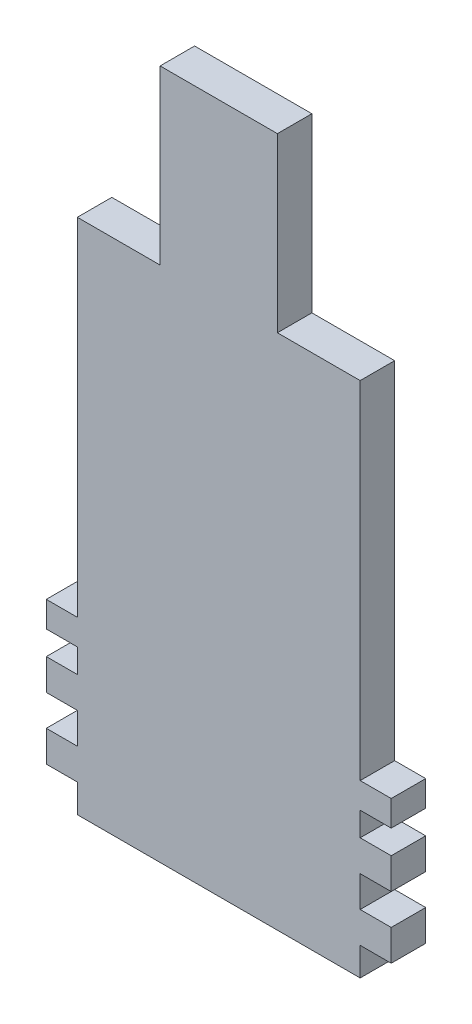
ISO-10303-21;
HEADER;
FILE_DESCRIPTION(('STEP AP214'),'2;1');
FILE_NAME('part.step','',(''),(''),'','','');
FILE_SCHEMA(('AUTOMOTIVE_DESIGN { 1 0 10303 214 1 1 1 1 }'));
ENDSEC;
DATA;
#1=APPLICATION_CONTEXT('core data for automotive mechanical design processes');
#2=APPLICATION_PROTOCOL_DEFINITION('international standard','automotive_design',2000,#1);
#3=PRODUCT_CONTEXT('',#1,'mechanical');
#4=PRODUCT('Part','Part','',(#3));
#5=PRODUCT_RELATED_PRODUCT_CATEGORY('part','',(#4));
#6=PRODUCT_DEFINITION_FORMATION('','',#4);
#7=PRODUCT_DEFINITION_CONTEXT('part definition',#1,'design');
#8=PRODUCT_DEFINITION('design','',#6,#7);
#9=PRODUCT_DEFINITION_SHAPE('','',#8);
#10=(LENGTH_UNIT() NAMED_UNIT(*) SI_UNIT(.MILLI.,.METRE.));
#11=(NAMED_UNIT(*) PLANE_ANGLE_UNIT() SI_UNIT($,.RADIAN.));
#12=(NAMED_UNIT(*) SI_UNIT($,.STERADIAN.) SOLID_ANGLE_UNIT());
#13=UNCERTAINTY_MEASURE_WITH_UNIT(LENGTH_MEASURE(1.E-05),#10,'distance_accuracy_value','');
#14=(GEOMETRIC_REPRESENTATION_CONTEXT(3) GLOBAL_UNCERTAINTY_ASSIGNED_CONTEXT((#13)) GLOBAL_UNIT_ASSIGNED_CONTEXT((#10,
#11,#12)) REPRESENTATION_CONTEXT('',''));
#15=CARTESIAN_POINT('',(0.,0.,0.));
#16=DIRECTION('',(0.,0.,1.));
#17=DIRECTION('',(1.,0.,0.));
#18=AXIS2_PLACEMENT_3D('',#15,#16,#17);
#19=CARTESIAN_POINT('',(0.,134.780205209706,5.));
#20=DIRECTION('',(0.,1.,0.));
#21=DIRECTION('',(0.,0.,1.));
#22=AXIS2_PLACEMENT_3D('',#19,#20,#21);
#23=PLANE('',#22);
#24=DIRECTION('',(1.,0.,0.));
#25=VECTOR('',#24,1.);
#26=CARTESIAN_POINT('',(0.,134.780205209706,0.));
#27=LINE('',#26,#25);
#28=CARTESIAN_POINT('',(-76.921426264111,134.780205209706,0.));
#29=VERTEX_POINT('',#28);
#30=CARTESIAN_POINT('',(-59.921426264111,134.780205209706,0.));
#31=VERTEX_POINT('',#30);
#32=EDGE_CURVE('E271',#29,#31,#27,.T.);
#33=ORIENTED_EDGE('',*,*,#32,.F.);
#34=DIRECTION('',(0.,0.,-1.));
#35=VECTOR('',#34,1.);
#36=CARTESIAN_POINT('',(-76.921426264111,134.780205209706,5.));
#37=LINE('',#36,#35);
#38=CARTESIAN_POINT('',(-76.921426264111,134.780205209706,5.));
#39=VERTEX_POINT('',#38);
#40=EDGE_CURVE('E11',#39,#29,#37,.T.);
#41=ORIENTED_EDGE('',*,*,#40,.F.);
#42=DIRECTION('',(1.,0.,0.));
#43=VECTOR('',#42,1.);
#44=CARTESIAN_POINT('',(0.,134.780205209706,5.));
#45=LINE('',#44,#43);
#46=CARTESIAN_POINT('',(-59.921426264111,134.780205209706,5.));
#47=VERTEX_POINT('',#46);
#48=EDGE_CURVE('E356',#39,#47,#45,.T.);
#49=ORIENTED_EDGE('',*,*,#48,.T.);
#50=DIRECTION('',(0.,0.,-1.));
#51=VECTOR('',#50,1.);
#52=CARTESIAN_POINT('',(-59.921426264111,134.780205209706,5.));
#53=LINE('',#52,#51);
#54=EDGE_CURVE('E158',#47,#31,#53,.T.);
#55=ORIENTED_EDGE('',*,*,#54,.T.);
#56=EDGE_LOOP('',(#33,#41,#49,#55));
#57=FACE_BOUND('',#56,.T.);
#58=ADVANCED_FACE('F35',(#57),#23,.T.);
#59=CARTESIAN_POINT('',(-76.921426264111,0.,5.));
#60=DIRECTION('',(-1.,0.,0.));
#61=DIRECTION('',(0.,0.,1.));
#62=AXIS2_PLACEMENT_3D('',#59,#60,#61);
#63=PLANE('',#62);
#64=DIRECTION('',(0.,1.,0.));
#65=VECTOR('',#64,1.);
#66=CARTESIAN_POINT('',(-76.921426264111,0.,0.));
#67=LINE('',#66,#65);
#68=CARTESIAN_POINT('',(-76.921426264111,109.780205209706,0.));
#69=VERTEX_POINT('',#68);
#70=EDGE_CURVE('E274',#69,#29,#67,.T.);
#71=ORIENTED_EDGE('',*,*,#70,.F.);
#72=DIRECTION('',(0.,0.,-1.));
#73=VECTOR('',#72,1.);
#74=CARTESIAN_POINT('',(-76.921426264111,109.780205209706,5.));
#75=LINE('',#74,#73);
#76=CARTESIAN_POINT('',(-76.921426264111,109.780205209706,5.));
#77=VERTEX_POINT('',#76);
#78=EDGE_CURVE('E43',#77,#69,#75,.T.);
#79=ORIENTED_EDGE('',*,*,#78,.F.);
#80=DIRECTION('',(0.,1.,0.));
#81=VECTOR('',#80,1.);
#82=CARTESIAN_POINT('',(-76.921426264111,0.,5.));
#83=LINE('',#82,#81);
#84=EDGE_CURVE('E438',#77,#39,#83,.T.);
#85=ORIENTED_EDGE('',*,*,#84,.T.);
#86=ORIENTED_EDGE('',*,*,#40,.T.);
#87=EDGE_LOOP('',(#71,#79,#85,#86));
#88=FACE_BOUND('',#87,.T.);
#89=ADVANCED_FACE('F426',(#88),#63,.T.);
#90=CARTESIAN_POINT('',(0.,109.780205209706,5.));
#91=DIRECTION('',(0.,1.,0.));
#92=DIRECTION('',(0.,0.,1.));
#93=AXIS2_PLACEMENT_3D('',#90,#91,#92);
#94=PLANE('',#93);
#95=DIRECTION('',(1.,0.,0.));
#96=VECTOR('',#95,1.);
#97=CARTESIAN_POINT('',(0.,109.780205209706,0.));
#98=LINE('',#97,#96);
#99=CARTESIAN_POINT('',(-88.9214262641108,109.780205209706,0.));
#100=VERTEX_POINT('',#99);
#101=EDGE_CURVE('E277',#100,#69,#98,.T.);
#102=ORIENTED_EDGE('',*,*,#101,.F.);
#103=DIRECTION('',(0.,0.,-1.));
#104=VECTOR('',#103,1.);
#105=CARTESIAN_POINT('',(-88.9214262641108,109.780205209706,5.));
#106=LINE('',#105,#104);
#107=CARTESIAN_POINT('',(-88.9214262641108,109.780205209706,5.));
#108=VERTEX_POINT('',#107);
#109=EDGE_CURVE('E415',#108,#100,#106,.T.);
#110=ORIENTED_EDGE('',*,*,#109,.F.);
#111=DIRECTION('',(1.,0.,0.));
#112=VECTOR('',#111,1.);
#113=CARTESIAN_POINT('',(0.,109.780205209706,5.));
#114=LINE('',#113,#112);
#115=EDGE_CURVE('E422',#108,#77,#114,.T.);
#116=ORIENTED_EDGE('',*,*,#115,.T.);
#117=ORIENTED_EDGE('',*,*,#78,.T.);
#118=EDGE_LOOP('',(#102,#110,#116,#117));
#119=FACE_BOUND('',#118,.T.);
#120=ADVANCED_FACE('F420',(#119),#94,.T.);
#121=CARTESIAN_POINT('',(-88.921426264112,9.82996824033786E-13,5.));
#122=DIRECTION('',(-1.,0.,0.));
#123=DIRECTION('',(0.,-1.,0.));
#124=AXIS2_PLACEMENT_3D('',#121,#122,#123);
#125=PLANE('',#124);
#126=DIRECTION('',(0.,1.,0.));
#127=VECTOR('',#126,1.);
#128=CARTESIAN_POINT('',(-88.921426264112,9.82996824033786E-13,0.));
#129=LINE('',#128,#127);
#130=CARTESIAN_POINT('',(-88.9214262641113,59.5650812097062,0.));
#131=VERTEX_POINT('',#130);
#132=EDGE_CURVE('E280',#131,#100,#129,.T.);
#133=ORIENTED_EDGE('',*,*,#132,.F.);
#134=DIRECTION('',(0.,0.,-1.));
#135=VECTOR('',#134,1.);
#136=CARTESIAN_POINT('',(-88.9214262641113,59.5650812097062,5.));
#137=LINE('',#136,#135);
#138=CARTESIAN_POINT('',(-88.9214262641113,59.5650812097062,5.));
#139=VERTEX_POINT('',#138);
#140=EDGE_CURVE('E413',#139,#131,#137,.T.);
#141=ORIENTED_EDGE('',*,*,#140,.F.);
#142=DIRECTION('',(0.,1.,0.));
#143=VECTOR('',#142,1.);
#144=CARTESIAN_POINT('',(-88.921426264112,9.82996824033786E-13,5.));
#145=LINE('',#144,#143);
#146=EDGE_CURVE('E435',#139,#108,#145,.T.);
#147=ORIENTED_EDGE('',*,*,#146,.T.);
#148=ORIENTED_EDGE('',*,*,#109,.T.);
#149=EDGE_LOOP('',(#133,#141,#147,#148));
#150=FACE_BOUND('',#149,.T.);
#151=ADVANCED_FACE('F432',(#150),#125,.T.);
#152=CARTESIAN_POINT('',(1.83695901729669E-13,59.5650812097059,5.));
#153=DIRECTION('',(0.,1.,0.));
#154=DIRECTION('',(-1.,0.,0.));
#155=AXIS2_PLACEMENT_3D('',#152,#153,#154);
#156=PLANE('',#155);
#157=DIRECTION('',(1.,0.,0.));
#158=VECTOR('',#157,1.);
#159=CARTESIAN_POINT('',(1.83695901729669E-13,59.5650812097059,0.));
#160=LINE('',#159,#158);
#161=CARTESIAN_POINT('',(-93.4214262641115,59.5650812097062,0.));
#162=VERTEX_POINT('',#161);
#163=EDGE_CURVE('E283',#162,#131,#160,.T.);
#164=ORIENTED_EDGE('',*,*,#163,.F.);
#165=DIRECTION('',(0.,0.,-1.));
#166=VECTOR('',#165,1.);
#167=CARTESIAN_POINT('',(-93.4214262641115,59.5650812097062,5.));
#168=LINE('',#167,#166);
#169=CARTESIAN_POINT('',(-93.4214262641115,59.5650812097062,5.));
#170=VERTEX_POINT('',#169);
#171=EDGE_CURVE('E411',#170,#162,#168,.T.);
#172=ORIENTED_EDGE('',*,*,#171,.F.);
#173=DIRECTION('',(1.,0.,0.));
#174=VECTOR('',#173,1.);
#175=CARTESIAN_POINT('',(1.83695901729669E-13,59.5650812097059,5.));
#176=LINE('',#175,#174);
#177=EDGE_CURVE('E440',#170,#139,#176,.T.);
#178=ORIENTED_EDGE('',*,*,#177,.T.);
#179=ORIENTED_EDGE('',*,*,#140,.T.);
#180=EDGE_LOOP('',(#164,#172,#178,#179));
#181=FACE_BOUND('',#180,.T.);
#182=ADVANCED_FACE('F526',(#181),#156,.T.);
#183=CARTESIAN_POINT('',(-93.4214262641124,1.39378120235169E-12,5.));
#184=DIRECTION('',(-1.,0.,0.));
#185=DIRECTION('',(0.,-1.,0.));
#186=AXIS2_PLACEMENT_3D('',#183,#184,#185);
#187=PLANE('',#186);
#188=DIRECTION('',(0.,1.,0.));
#189=VECTOR('',#188,1.);
#190=CARTESIAN_POINT('',(-93.4214262641124,1.39378120235169E-12,0.));
#191=LINE('',#190,#189);
#192=CARTESIAN_POINT('',(-93.4214262641115,55.8443172097062,0.));
#193=VERTEX_POINT('',#192);
#194=EDGE_CURVE('E286',#193,#162,#191,.T.);
#195=ORIENTED_EDGE('',*,*,#194,.F.);
#196=DIRECTION('',(0.,0.,-1.));
#197=VECTOR('',#196,1.);
#198=CARTESIAN_POINT('',(-93.4214262641115,55.8443172097062,5.));
#199=LINE('',#198,#197);
#200=CARTESIAN_POINT('',(-93.4214262641115,55.8443172097062,5.));
#201=VERTEX_POINT('',#200);
#202=EDGE_CURVE('E409',#201,#193,#199,.T.);
#203=ORIENTED_EDGE('',*,*,#202,.F.);
#204=DIRECTION('',(0.,1.,0.));
#205=VECTOR('',#204,1.);
#206=CARTESIAN_POINT('',(-93.4214262641124,1.39378120235169E-12,5.));
#207=LINE('',#206,#205);
#208=EDGE_CURVE('E446',#201,#170,#207,.T.);
#209=ORIENTED_EDGE('',*,*,#208,.T.);
#210=ORIENTED_EDGE('',*,*,#171,.T.);
#211=EDGE_LOOP('',(#195,#203,#209,#210));
#212=FACE_BOUND('',#211,.T.);
#213=ADVANCED_FACE('F529',(#212),#187,.T.);
#214=CARTESIAN_POINT('',(1.72221241001906E-13,55.8443172097059,5.));
#215=DIRECTION('',(0.,1.,0.));
#216=DIRECTION('',(-1.,0.,0.));
#217=AXIS2_PLACEMENT_3D('',#214,#215,#216);
#218=PLANE('',#217);
#219=DIRECTION('',(1.,0.,0.));
#220=VECTOR('',#219,1.);
#221=CARTESIAN_POINT('',(1.72221241001906E-13,55.8443172097059,0.));
#222=LINE('',#221,#220);
#223=CARTESIAN_POINT('',(-88.9214262641115,55.8443172097061,0.));
#224=VERTEX_POINT('',#223);
#225=EDGE_CURVE('E289',#193,#224,#222,.T.);
#226=ORIENTED_EDGE('',*,*,#225,.T.);
#227=DIRECTION('',(0.,0.,-1.));
#228=VECTOR('',#227,1.);
#229=CARTESIAN_POINT('',(-88.9214262641115,55.8443172097061,5.));
#230=LINE('',#229,#228);
#231=CARTESIAN_POINT('',(-88.9214262641115,55.8443172097061,5.));
#232=VERTEX_POINT('',#231);
#233=EDGE_CURVE('E407',#232,#224,#230,.T.);
#234=ORIENTED_EDGE('',*,*,#233,.F.);
#235=DIRECTION('',(1.,0.,0.));
#236=VECTOR('',#235,1.);
#237=CARTESIAN_POINT('',(1.72221241001906E-13,55.8443172097059,5.));
#238=LINE('',#237,#236);
#239=EDGE_CURVE('E449',#201,#232,#238,.T.);
#240=ORIENTED_EDGE('',*,*,#239,.F.);
#241=ORIENTED_EDGE('',*,*,#202,.T.);
#242=EDGE_LOOP('',(#226,#234,#240,#241));
#243=FACE_BOUND('',#242,.T.);
#244=ADVANCED_FACE('F533',(#243),#218,.F.);
#245=CARTESIAN_POINT('',(-88.9214262641117,3.56233483577195E-13,5.));
#246=DIRECTION('',(-1.,0.,0.));
#247=DIRECTION('',(0.,-1.,0.));
#248=AXIS2_PLACEMENT_3D('',#245,#246,#247);
#249=PLANE('',#248);
#250=DIRECTION('',(0.,1.,0.));
#251=VECTOR('',#250,1.);
#252=CARTESIAN_POINT('',(-88.9214262641117,3.56233483577195E-13,0.));
#253=LINE('',#252,#251);
#254=CARTESIAN_POINT('',(-88.9214262641115,52.3802052097061,0.));
#255=VERTEX_POINT('',#254);
#256=EDGE_CURVE('E292',#255,#224,#253,.T.);
#257=ORIENTED_EDGE('',*,*,#256,.F.);
#258=DIRECTION('',(0.,0.,-1.));
#259=VECTOR('',#258,1.);
#260=CARTESIAN_POINT('',(-88.9214262641115,52.3802052097061,5.));
#261=LINE('',#260,#259);
#262=CARTESIAN_POINT('',(-88.9214262641115,52.3802052097061,5.));
#263=VERTEX_POINT('',#262);
#264=EDGE_CURVE('E405',#263,#255,#261,.T.);
#265=ORIENTED_EDGE('',*,*,#264,.F.);
#266=DIRECTION('',(0.,1.,0.));
#267=VECTOR('',#266,1.);
#268=CARTESIAN_POINT('',(-88.9214262641117,3.56233483577195E-13,5.));
#269=LINE('',#268,#267);
#270=EDGE_CURVE('E451',#263,#232,#269,.T.);
#271=ORIENTED_EDGE('',*,*,#270,.T.);
#272=ORIENTED_EDGE('',*,*,#233,.T.);
#273=EDGE_LOOP('',(#257,#265,#271,#272));
#274=FACE_BOUND('',#273,.T.);
#275=ADVANCED_FACE('F537',(#274),#249,.T.);
#276=CARTESIAN_POINT('',(-2.42307124410028E-13,52.3802052097066,5.));
#277=DIRECTION('',(0.,1.,0.));
#278=DIRECTION('',(-1.,0.,0.));
#279=AXIS2_PLACEMENT_3D('',#276,#277,#278);
#280=PLANE('',#279);
#281=DIRECTION('',(1.,0.,0.));
#282=VECTOR('',#281,1.);
#283=CARTESIAN_POINT('',(-2.42307124410028E-13,52.3802052097066,0.));
#284=LINE('',#283,#282);
#285=CARTESIAN_POINT('',(-93.4214262641115,52.3802052097061,0.));
#286=VERTEX_POINT('',#285);
#287=EDGE_CURVE('E295',#286,#255,#284,.T.);
#288=ORIENTED_EDGE('',*,*,#287,.F.);
#289=DIRECTION('',(0.,0.,-1.));
#290=VECTOR('',#289,1.);
#291=CARTESIAN_POINT('',(-93.4214262641115,52.3802052097061,5.));
#292=LINE('',#291,#290);
#293=CARTESIAN_POINT('',(-93.4214262641115,52.3802052097061,5.));
#294=VERTEX_POINT('',#293);
#295=EDGE_CURVE('E403',#294,#286,#292,.T.);
#296=ORIENTED_EDGE('',*,*,#295,.F.);
#297=DIRECTION('',(1.,0.,0.));
#298=VECTOR('',#297,1.);
#299=CARTESIAN_POINT('',(-2.42307124410028E-13,52.3802052097066,5.));
#300=LINE('',#299,#298);
#301=EDGE_CURVE('E454',#294,#263,#300,.T.);
#302=ORIENTED_EDGE('',*,*,#301,.T.);
#303=ORIENTED_EDGE('',*,*,#264,.T.);
#304=EDGE_LOOP('',(#288,#296,#302,#303));
#305=FACE_BOUND('',#304,.T.);
#306=ADVANCED_FACE('F541',(#305),#280,.T.);
#307=CARTESIAN_POINT('',(-93.4214262641054,-1.09480763900161E-11,5.));
#308=DIRECTION('',(-1.,-1.17190208154878E-13,0.));
#309=DIRECTION('',(1.17190208154878E-13,-1.,0.));
#310=AXIS2_PLACEMENT_3D('',#307,#308,#309);
#311=PLANE('',#310);
#312=DIRECTION('',(-1.17190208154878E-13,1.,0.));
#313=VECTOR('',#312,1.);
#314=CARTESIAN_POINT('',(-93.4214262641054,-1.09480763900161E-11,0.));
#315=LINE('',#314,#313);
#316=CARTESIAN_POINT('',(-93.421426264111,47.8802052097061,0.));
#317=VERTEX_POINT('',#316);
#318=EDGE_CURVE('E298',#317,#286,#315,.T.);
#319=ORIENTED_EDGE('',*,*,#318,.F.);
#320=DIRECTION('',(0.,0.,-1.));
#321=VECTOR('',#320,1.);
#322=CARTESIAN_POINT('',(-93.421426264111,47.8802052097061,5.));
#323=LINE('',#322,#321);
#324=CARTESIAN_POINT('',(-93.421426264111,47.8802052097061,5.));
#325=VERTEX_POINT('',#324);
#326=EDGE_CURVE('E401',#325,#317,#323,.T.);
#327=ORIENTED_EDGE('',*,*,#326,.F.);
#328=DIRECTION('',(-1.17190208154878E-13,1.,0.));
#329=VECTOR('',#328,1.);
#330=CARTESIAN_POINT('',(-93.4214262641054,-1.09480763900161E-11,5.));
#331=LINE('',#330,#329);
#332=EDGE_CURVE('E457',#325,#294,#331,.T.);
#333=ORIENTED_EDGE('',*,*,#332,.T.);
#334=ORIENTED_EDGE('',*,*,#295,.T.);
#335=EDGE_LOOP('',(#319,#327,#333,#334));
#336=FACE_BOUND('',#335,.T.);
#337=ADVANCED_FACE('F545',(#336),#311,.T.);
#338=CARTESIAN_POINT('',(-2.95320590264413E-13,47.8802052097067,5.));
#339=DIRECTION('',(0.,1.,0.));
#340=DIRECTION('',(-1.,0.,0.));
#341=AXIS2_PLACEMENT_3D('',#338,#339,#340);
#342=PLANE('',#341);
#343=DIRECTION('',(1.,0.,0.));
#344=VECTOR('',#343,1.);
#345=CARTESIAN_POINT('',(-2.95320590264413E-13,47.8802052097067,0.));
#346=LINE('',#345,#344);
#347=CARTESIAN_POINT('',(-88.9214262641111,47.8802052097062,0.));
#348=VERTEX_POINT('',#347);
#349=EDGE_CURVE('E301',#317,#348,#346,.T.);
#350=ORIENTED_EDGE('',*,*,#349,.T.);
#351=DIRECTION('',(0.,0.,-1.));
#352=VECTOR('',#351,1.);
#353=CARTESIAN_POINT('',(-88.9214262641111,47.8802052097062,5.));
#354=LINE('',#353,#352);
#355=CARTESIAN_POINT('',(-88.9214262641111,47.8802052097062,5.));
#356=VERTEX_POINT('',#355);
#357=EDGE_CURVE('E399',#356,#348,#354,.T.);
#358=ORIENTED_EDGE('',*,*,#357,.F.);
#359=DIRECTION('',(1.,0.,0.));
#360=VECTOR('',#359,1.);
#361=CARTESIAN_POINT('',(-2.95320590264413E-13,47.8802052097067,5.));
#362=LINE('',#361,#360);
#363=EDGE_CURVE('E460',#325,#356,#362,.T.);
#364=ORIENTED_EDGE('',*,*,#363,.F.);
#365=ORIENTED_EDGE('',*,*,#326,.T.);
#366=EDGE_LOOP('',(#350,#358,#364,#365));
#367=FACE_BOUND('',#366,.T.);
#368=ADVANCED_FACE('F549',(#367),#342,.F.);
#369=CARTESIAN_POINT('',(-88.9214262641108,-5.48458971227346E-13,5.));
#370=DIRECTION('',(-1.,0.,0.));
#371=DIRECTION('',(0.,-1.,0.));
#372=AXIS2_PLACEMENT_3D('',#369,#370,#371);
#373=PLANE('',#372);
#374=DIRECTION('',(0.,1.,0.));
#375=VECTOR('',#374,1.);
#376=CARTESIAN_POINT('',(-88.9214262641108,-5.48458971227346E-13,0.));
#377=LINE('',#376,#375);
#378=CARTESIAN_POINT('',(-88.921426264111,43.3802052097061,0.));
#379=VERTEX_POINT('',#378);
#380=EDGE_CURVE('E304',#379,#348,#377,.T.);
#381=ORIENTED_EDGE('',*,*,#380,.F.);
#382=DIRECTION('',(0.,0.,-1.));
#383=VECTOR('',#382,1.);
#384=CARTESIAN_POINT('',(-88.921426264111,43.3802052097061,5.));
#385=LINE('',#384,#383);
#386=CARTESIAN_POINT('',(-88.921426264111,43.3802052097061,5.));
#387=VERTEX_POINT('',#386);
#388=EDGE_CURVE('E397',#387,#379,#385,.T.);
#389=ORIENTED_EDGE('',*,*,#388,.F.);
#390=DIRECTION('',(0.,1.,0.));
#391=VECTOR('',#390,1.);
#392=CARTESIAN_POINT('',(-88.9214262641108,-5.48458971227346E-13,5.));
#393=LINE('',#392,#391);
#394=EDGE_CURVE('E462',#387,#356,#393,.T.);
#395=ORIENTED_EDGE('',*,*,#394,.T.);
#396=ORIENTED_EDGE('',*,*,#357,.T.);
#397=EDGE_LOOP('',(#381,#389,#395,#396));
#398=FACE_BOUND('',#397,.T.);
#399=ADVANCED_FACE('F553',(#398),#373,.T.);
#400=CARTESIAN_POINT('',(-1.33782507324388E-13,43.3802052097064,5.));
#401=DIRECTION('',(0.,1.,0.));
#402=DIRECTION('',(-1.,0.,0.));
#403=AXIS2_PLACEMENT_3D('',#400,#401,#402);
#404=PLANE('',#403);
#405=DIRECTION('',(1.,0.,0.));
#406=VECTOR('',#405,1.);
#407=CARTESIAN_POINT('',(-1.33782507324388E-13,43.3802052097064,0.));
#408=LINE('',#407,#406);
#409=CARTESIAN_POINT('',(-93.4214262641111,43.3802052097061,0.));
#410=VERTEX_POINT('',#409);
#411=EDGE_CURVE('E307',#410,#379,#408,.T.);
#412=ORIENTED_EDGE('',*,*,#411,.F.);
#413=DIRECTION('',(0.,0.,-1.));
#414=VECTOR('',#413,1.);
#415=CARTESIAN_POINT('',(-93.4214262641111,43.3802052097061,5.));
#416=LINE('',#415,#414);
#417=CARTESIAN_POINT('',(-93.4214262641111,43.3802052097061,5.));
#418=VERTEX_POINT('',#417);
#419=EDGE_CURVE('E395',#418,#410,#416,.T.);
#420=ORIENTED_EDGE('',*,*,#419,.F.);
#421=DIRECTION('',(1.,0.,0.));
#422=VECTOR('',#421,1.);
#423=CARTESIAN_POINT('',(-1.33782507324388E-13,43.3802052097064,5.));
#424=LINE('',#423,#422);
#425=EDGE_CURVE('E465',#418,#387,#424,.T.);
#426=ORIENTED_EDGE('',*,*,#425,.T.);
#427=ORIENTED_EDGE('',*,*,#388,.T.);
#428=EDGE_LOOP('',(#412,#420,#426,#427));
#429=FACE_BOUND('',#428,.T.);
#430=ADVANCED_FACE('F557',(#429),#404,.T.);
#431=CARTESIAN_POINT('',(-93.4214262641108,-5.76214546842989E-13,5.));
#432=DIRECTION('',(-1.,0.,0.));
#433=DIRECTION('',(0.,-1.,0.));
#434=AXIS2_PLACEMENT_3D('',#431,#432,#433);
#435=PLANE('',#434);
#436=DIRECTION('',(0.,1.,0.));
#437=VECTOR('',#436,1.);
#438=CARTESIAN_POINT('',(-93.4214262641108,-5.76214546842989E-13,0.));
#439=LINE('',#438,#437);
#440=CARTESIAN_POINT('',(-93.421426264111,38.8802052097061,0.));
#441=VERTEX_POINT('',#440);
#442=EDGE_CURVE('E310',#441,#410,#439,.T.);
#443=ORIENTED_EDGE('',*,*,#442,.F.);
#444=DIRECTION('',(0.,0.,-1.));
#445=VECTOR('',#444,1.);
#446=CARTESIAN_POINT('',(-93.421426264111,38.8802052097061,5.));
#447=LINE('',#446,#445);
#448=CARTESIAN_POINT('',(-93.421426264111,38.8802052097061,5.));
#449=VERTEX_POINT('',#448);
#450=EDGE_CURVE('E393',#449,#441,#447,.T.);
#451=ORIENTED_EDGE('',*,*,#450,.F.);
#452=DIRECTION('',(0.,1.,0.));
#453=VECTOR('',#452,1.);
#454=CARTESIAN_POINT('',(-93.4214262641108,-5.76214546842989E-13,5.));
#455=LINE('',#454,#453);
#456=EDGE_CURVE('E468',#449,#418,#455,.T.);
#457=ORIENTED_EDGE('',*,*,#456,.T.);
#458=ORIENTED_EDGE('',*,*,#419,.T.);
#459=EDGE_LOOP('',(#443,#451,#457,#458));
#460=FACE_BOUND('',#459,.T.);
#461=ADVANCED_FACE('F561',(#460),#435,.T.);
#462=CARTESIAN_POINT('',(-1.79857079274863E-13,38.8802052097066,5.));
#463=DIRECTION('',(0.,1.,0.));
#464=DIRECTION('',(-1.,0.,0.));
#465=AXIS2_PLACEMENT_3D('',#462,#463,#464);
#466=PLANE('',#465);
#467=DIRECTION('',(1.,0.,0.));
#468=VECTOR('',#467,1.);
#469=CARTESIAN_POINT('',(-1.79857079274863E-13,38.8802052097066,0.));
#470=LINE('',#469,#468);
#471=CARTESIAN_POINT('',(-88.921426264111,38.8802052097061,0.));
#472=VERTEX_POINT('',#471);
#473=EDGE_CURVE('E313',#441,#472,#470,.T.);
#474=ORIENTED_EDGE('',*,*,#473,.T.);
#475=DIRECTION('',(0.,0.,-1.));
#476=VECTOR('',#475,1.);
#477=CARTESIAN_POINT('',(-88.921426264111,38.8802052097061,5.));
#478=LINE('',#477,#476);
#479=CARTESIAN_POINT('',(-88.921426264111,38.8802052097061,5.));
#480=VERTEX_POINT('',#479);
#481=EDGE_CURVE('E391',#480,#472,#478,.T.);
#482=ORIENTED_EDGE('',*,*,#481,.F.);
#483=DIRECTION('',(1.,0.,0.));
#484=VECTOR('',#483,1.);
#485=CARTESIAN_POINT('',(-1.79857079274863E-13,38.8802052097066,5.));
#486=LINE('',#485,#484);
#487=EDGE_CURVE('E471',#449,#480,#486,.T.);
#488=ORIENTED_EDGE('',*,*,#487,.F.);
#489=ORIENTED_EDGE('',*,*,#450,.T.);
#490=EDGE_LOOP('',(#474,#482,#488,#489));
#491=FACE_BOUND('',#490,.T.);
#492=ADVANCED_FACE('F565',(#491),#466,.F.);
#493=CARTESIAN_POINT('',(-88.9214262641109,-3.0098358177111E-13,5.));
#494=DIRECTION('',(-1.,0.,0.));
#495=DIRECTION('',(0.,-1.,0.));
#496=AXIS2_PLACEMENT_3D('',#493,#494,#495);
#497=PLANE('',#496);
#498=DIRECTION('',(0.,1.,0.));
#499=VECTOR('',#498,1.);
#500=CARTESIAN_POINT('',(-88.9214262641109,-3.0098358177111E-13,0.));
#501=LINE('',#500,#499);
#502=CARTESIAN_POINT('',(-88.921426264111,34.7802052097062,0.));
#503=VERTEX_POINT('',#502);
#504=EDGE_CURVE('E316',#503,#472,#501,.T.);
#505=ORIENTED_EDGE('',*,*,#504,.F.);
#506=DIRECTION('',(0.,0.,-1.));
#507=VECTOR('',#506,1.);
#508=CARTESIAN_POINT('',(-88.921426264111,34.7802052097062,5.));
#509=LINE('',#508,#507);
#510=CARTESIAN_POINT('',(-88.921426264111,34.7802052097062,5.));
#511=VERTEX_POINT('',#510);
#512=EDGE_CURVE('E389',#511,#503,#509,.T.);
#513=ORIENTED_EDGE('',*,*,#512,.F.);
#514=DIRECTION('',(0.,1.,0.));
#515=VECTOR('',#514,1.);
#516=CARTESIAN_POINT('',(-88.9214262641109,-3.0098358177111E-13,5.));
#517=LINE('',#516,#515);
#518=EDGE_CURVE('E473',#511,#480,#517,.T.);
#519=ORIENTED_EDGE('',*,*,#518,.T.);
#520=ORIENTED_EDGE('',*,*,#481,.T.);
#521=EDGE_LOOP('',(#505,#513,#519,#520));
#522=FACE_BOUND('',#521,.T.);
#523=ADVANCED_FACE('F569',(#522),#497,.T.);
#524=CARTESIAN_POINT('',(0.,34.780205209706,5.));
#525=DIRECTION('',(0.,-1.,0.));
#526=DIRECTION('',(1.,0.,0.));
#527=AXIS2_PLACEMENT_3D('',#524,#525,#526);
#528=PLANE('',#527);
#529=DIRECTION('',(-1.,0.,0.));
#530=VECTOR('',#529,1.);
#531=CARTESIAN_POINT('',(0.,34.780205209706,0.));
#532=LINE('',#531,#530);
#533=CARTESIAN_POINT('',(-47.921426264111,34.7802052097061,0.));
#534=VERTEX_POINT('',#533);
#535=EDGE_CURVE('E319',#534,#503,#532,.T.);
#536=ORIENTED_EDGE('',*,*,#535,.F.);
#537=DIRECTION('',(0.,0.,-1.));
#538=VECTOR('',#537,1.);
#539=CARTESIAN_POINT('',(-47.921426264111,34.7802052097061,5.));
#540=LINE('',#539,#538);
#541=CARTESIAN_POINT('',(-47.921426264111,34.7802052097061,5.));
#542=VERTEX_POINT('',#541);
#543=EDGE_CURVE('E387',#542,#534,#540,.T.);
#544=ORIENTED_EDGE('',*,*,#543,.F.);
#545=DIRECTION('',(-1.,0.,0.));
#546=VECTOR('',#545,1.);
#547=CARTESIAN_POINT('',(0.,34.780205209706,5.));
#548=LINE('',#547,#546);
#549=EDGE_CURVE('E476',#542,#511,#548,.T.);
#550=ORIENTED_EDGE('',*,*,#549,.T.);
#551=ORIENTED_EDGE('',*,*,#512,.T.);
#552=EDGE_LOOP('',(#536,#544,#550,#551));
#553=FACE_BOUND('',#552,.T.);
#554=ADVANCED_FACE('F573',(#553),#528,.T.);
#555=CARTESIAN_POINT('',(-47.9214262641113,4.05514259232417E-13,5.));
#556=DIRECTION('',(-1.,0.,0.));
#557=DIRECTION('',(0.,-1.,0.));
#558=AXIS2_PLACEMENT_3D('',#555,#556,#557);
#559=PLANE('',#558);
#560=DIRECTION('',(0.,1.,0.));
#561=VECTOR('',#560,1.);
#562=CARTESIAN_POINT('',(-47.9214262641113,4.05514259232417E-13,0.));
#563=LINE('',#562,#561);
#564=CARTESIAN_POINT('',(-47.921426264111,38.8802052097061,0.));
#565=VERTEX_POINT('',#564);
#566=EDGE_CURVE('E322',#534,#565,#563,.T.);
#567=ORIENTED_EDGE('',*,*,#566,.T.);
#568=DIRECTION('',(0.,0.,-1.));
#569=VECTOR('',#568,1.);
#570=CARTESIAN_POINT('',(-47.921426264111,38.8802052097061,5.));
#571=LINE('',#570,#569);
#572=CARTESIAN_POINT('',(-47.921426264111,38.8802052097061,5.));
#573=VERTEX_POINT('',#572);
#574=EDGE_CURVE('E385',#573,#565,#571,.T.);
#575=ORIENTED_EDGE('',*,*,#574,.F.);
#576=DIRECTION('',(0.,1.,0.));
#577=VECTOR('',#576,1.);
#578=CARTESIAN_POINT('',(-47.9214262641113,4.05514259232417E-13,5.));
#579=LINE('',#578,#577);
#580=EDGE_CURVE('E479',#542,#573,#579,.T.);
#581=ORIENTED_EDGE('',*,*,#580,.F.);
#582=ORIENTED_EDGE('',*,*,#543,.T.);
#583=EDGE_LOOP('',(#567,#575,#581,#582));
#584=FACE_BOUND('',#583,.T.);
#585=ADVANCED_FACE('F577',(#584),#559,.F.);
#586=CARTESIAN_POINT('',(3.59714158549718E-13,38.8802052097056,5.));
#587=DIRECTION('',(0.,-1.,0.));
#588=DIRECTION('',(1.,0.,0.));
#589=AXIS2_PLACEMENT_3D('',#586,#587,#588);
#590=PLANE('',#589);
#591=DIRECTION('',(-1.,0.,0.));
#592=VECTOR('',#591,1.);
#593=CARTESIAN_POINT('',(3.59714158549718E-13,38.8802052097056,0.));
#594=LINE('',#593,#592);
#595=CARTESIAN_POINT('',(-43.421426264111,38.880205209706,0.));
#596=VERTEX_POINT('',#595);
#597=EDGE_CURVE('E325',#596,#565,#594,.T.);
#598=ORIENTED_EDGE('',*,*,#597,.F.);
#599=DIRECTION('',(0.,0.,-1.));
#600=VECTOR('',#599,1.);
#601=CARTESIAN_POINT('',(-43.421426264111,38.880205209706,5.));
#602=LINE('',#601,#600);
#603=CARTESIAN_POINT('',(-43.421426264111,38.880205209706,5.));
#604=VERTEX_POINT('',#603);
#605=EDGE_CURVE('E383',#604,#596,#602,.T.);
#606=ORIENTED_EDGE('',*,*,#605,.F.);
#607=DIRECTION('',(-1.,0.,0.));
#608=VECTOR('',#607,1.);
#609=CARTESIAN_POINT('',(3.59714158549718E-13,38.8802052097056,5.));
#610=LINE('',#609,#608);
#611=EDGE_CURVE('E481',#604,#573,#610,.T.);
#612=ORIENTED_EDGE('',*,*,#611,.T.);
#613=ORIENTED_EDGE('',*,*,#574,.T.);
#614=EDGE_LOOP('',(#598,#606,#612,#613));
#615=FACE_BOUND('',#614,.T.);
#616=ADVANCED_FACE('F581',(#615),#590,.T.);
#617=CARTESIAN_POINT('',(-43.4214262641113,3.34774077781112E-13,5.));
#618=DIRECTION('',(-1.,0.,0.));
#619=DIRECTION('',(0.,-1.,0.));
#620=AXIS2_PLACEMENT_3D('',#617,#618,#619);
#621=PLANE('',#620);
#622=DIRECTION('',(0.,1.,0.));
#623=VECTOR('',#622,1.);
#624=CARTESIAN_POINT('',(-43.4214262641113,3.34774077781112E-13,0.));
#625=LINE('',#624,#623);
#626=CARTESIAN_POINT('',(-43.4214262641109,43.380205209706,0.));
#627=VERTEX_POINT('',#626);
#628=EDGE_CURVE('E328',#596,#627,#625,.T.);
#629=ORIENTED_EDGE('',*,*,#628,.T.);
#630=DIRECTION('',(0.,0.,-1.));
#631=VECTOR('',#630,1.);
#632=CARTESIAN_POINT('',(-43.4214262641109,43.380205209706,5.));
#633=LINE('',#632,#631);
#634=CARTESIAN_POINT('',(-43.4214262641109,43.380205209706,5.));
#635=VERTEX_POINT('',#634);
#636=EDGE_CURVE('E380',#635,#627,#633,.T.);
#637=ORIENTED_EDGE('',*,*,#636,.F.);
#638=DIRECTION('',(0.,1.,0.));
#639=VECTOR('',#638,1.);
#640=CARTESIAN_POINT('',(-43.4214262641113,3.34774077781112E-13,5.));
#641=LINE('',#640,#639);
#642=EDGE_CURVE('E484',#604,#635,#641,.T.);
#643=ORIENTED_EDGE('',*,*,#642,.F.);
#644=ORIENTED_EDGE('',*,*,#605,.T.);
#645=EDGE_LOOP('',(#629,#637,#643,#644));
#646=FACE_BOUND('',#645,.T.);
#647=ADVANCED_FACE('F585',(#646),#621,.F.);
#648=CARTESIAN_POINT('',(2.67565014648773E-13,43.3802052097057,5.));
#649=DIRECTION('',(0.,-1.,0.));
#650=DIRECTION('',(1.,0.,0.));
#651=AXIS2_PLACEMENT_3D('',#648,#649,#650);
#652=PLANE('',#651);
#653=DIRECTION('',(-1.,0.,0.));
#654=VECTOR('',#653,1.);
#655=CARTESIAN_POINT('',(2.67565014648773E-13,43.3802052097057,0.));
#656=LINE('',#655,#654);
#657=CARTESIAN_POINT('',(-47.921426264111,43.380205209706,0.));
#658=VERTEX_POINT('',#657);
#659=EDGE_CURVE('E330',#627,#658,#656,.T.);
#660=ORIENTED_EDGE('',*,*,#659,.T.);
#661=DIRECTION('',(0.,0.,-1.));
#662=VECTOR('',#661,1.);
#663=CARTESIAN_POINT('',(-47.921426264111,43.380205209706,5.));
#664=LINE('',#663,#662);
#665=CARTESIAN_POINT('',(-47.921426264111,43.380205209706,5.));
#666=VERTEX_POINT('',#665);
#667=EDGE_CURVE('E377',#666,#658,#664,.T.);
#668=ORIENTED_EDGE('',*,*,#667,.F.);
#669=DIRECTION('',(-1.,0.,0.));
#670=VECTOR('',#669,1.);
#671=CARTESIAN_POINT('',(2.67565014648773E-13,43.3802052097057,5.));
#672=LINE('',#671,#670);
#673=EDGE_CURVE('E486',#635,#666,#672,.T.);
#674=ORIENTED_EDGE('',*,*,#673,.F.);
#675=ORIENTED_EDGE('',*,*,#636,.T.);
#676=EDGE_LOOP('',(#660,#668,#674,#675));
#677=FACE_BOUND('',#676,.T.);
#678=ADVANCED_FACE('F589',(#677),#652,.F.);
#679=CARTESIAN_POINT('',(-47.9214262641113,3.69468547300641E-13,5.));
#680=DIRECTION('',(-1.,0.,0.));
#681=DIRECTION('',(0.,-1.,0.));
#682=AXIS2_PLACEMENT_3D('',#679,#680,#681);
#683=PLANE('',#682);
#684=DIRECTION('',(0.,1.,0.));
#685=VECTOR('',#684,1.);
#686=CARTESIAN_POINT('',(-47.9214262641113,3.69468547300641E-13,0.));
#687=LINE('',#686,#685);
#688=CARTESIAN_POINT('',(-47.9214262641109,47.8802052097061,0.));
#689=VERTEX_POINT('',#688);
#690=EDGE_CURVE('E332',#658,#689,#687,.T.);
#691=ORIENTED_EDGE('',*,*,#690,.T.);
#692=DIRECTION('',(0.,0.,-1.));
#693=VECTOR('',#692,1.);
#694=CARTESIAN_POINT('',(-47.9214262641109,47.8802052097061,5.));
#695=LINE('',#694,#693);
#696=CARTESIAN_POINT('',(-47.9214262641109,47.8802052097061,5.));
#697=VERTEX_POINT('',#696);
#698=EDGE_CURVE('E375',#697,#689,#695,.T.);
#699=ORIENTED_EDGE('',*,*,#698,.F.);
#700=DIRECTION('',(0.,1.,0.));
#701=VECTOR('',#700,1.);
#702=CARTESIAN_POINT('',(-47.9214262641113,3.69468547300641E-13,5.));
#703=LINE('',#702,#701);
#704=EDGE_CURVE('E488',#666,#697,#703,.T.);
#705=ORIENTED_EDGE('',*,*,#704,.F.);
#706=ORIENTED_EDGE('',*,*,#667,.T.);
#707=EDGE_LOOP('',(#691,#699,#705,#706));
#708=FACE_BOUND('',#707,.T.);
#709=ADVANCED_FACE('F593',(#708),#683,.F.);
#710=CARTESIAN_POINT('',(3.69150737830508E-13,47.8802052097057,5.));
#711=DIRECTION('',(0.,-1.,0.));
#712=DIRECTION('',(1.,0.,0.));
#713=AXIS2_PLACEMENT_3D('',#710,#711,#712);
#714=PLANE('',#713);
#715=DIRECTION('',(-1.,0.,0.));
#716=VECTOR('',#715,1.);
#717=CARTESIAN_POINT('',(3.69150737830508E-13,47.8802052097057,0.));
#718=LINE('',#717,#716);
#719=CARTESIAN_POINT('',(-43.421426264111,47.8802052097061,0.));
#720=VERTEX_POINT('',#719);
#721=EDGE_CURVE('E335',#720,#689,#718,.T.);
#722=ORIENTED_EDGE('',*,*,#721,.F.);
#723=DIRECTION('',(0.,0.,-1.));
#724=VECTOR('',#723,1.);
#725=CARTESIAN_POINT('',(-43.421426264111,47.8802052097061,5.));
#726=LINE('',#725,#724);
#727=CARTESIAN_POINT('',(-43.421426264111,47.8802052097061,5.));
#728=VERTEX_POINT('',#727);
#729=EDGE_CURVE('E373',#728,#720,#726,.T.);
#730=ORIENTED_EDGE('',*,*,#729,.F.);
#731=DIRECTION('',(-1.,0.,0.));
#732=VECTOR('',#731,1.);
#733=CARTESIAN_POINT('',(3.69150737830508E-13,47.8802052097057,5.));
#734=LINE('',#733,#732);
#735=EDGE_CURVE('E490',#728,#697,#734,.T.);
#736=ORIENTED_EDGE('',*,*,#735,.T.);
#737=ORIENTED_EDGE('',*,*,#698,.T.);
#738=EDGE_LOOP('',(#722,#730,#736,#737));
#739=FACE_BOUND('',#738,.T.);
#740=ADVANCED_FACE('F597',(#739),#714,.T.);
#741=CARTESIAN_POINT('',(-43.4214262641167,5.22247561338601E-12,5.));
#742=DIRECTION('',(-1.,1.20274161001059E-13,0.));
#743=DIRECTION('',(-1.20274161001059E-13,-1.,0.));
#744=AXIS2_PLACEMENT_3D('',#741,#742,#743);
#745=PLANE('',#744);
#746=DIRECTION('',(1.20274161001059E-13,1.,0.));
#747=VECTOR('',#746,1.);
#748=CARTESIAN_POINT('',(-43.4214262641167,5.22247561338601E-12,0.));
#749=LINE('',#748,#747);
#750=CARTESIAN_POINT('',(-43.4214262641104,52.380205209706,0.));
#751=VERTEX_POINT('',#750);
#752=EDGE_CURVE('E338',#720,#751,#749,.T.);
#753=ORIENTED_EDGE('',*,*,#752,.T.);
#754=DIRECTION('',(0.,0.,-1.));
#755=VECTOR('',#754,1.);
#756=CARTESIAN_POINT('',(-43.4214262641104,52.380205209706,5.));
#757=LINE('',#756,#755);
#758=CARTESIAN_POINT('',(-43.4214262641104,52.380205209706,5.));
#759=VERTEX_POINT('',#758);
#760=EDGE_CURVE('E370',#759,#751,#757,.T.);
#761=ORIENTED_EDGE('',*,*,#760,.F.);
#762=DIRECTION('',(1.20274161001059E-13,1.,0.));
#763=VECTOR('',#762,1.);
#764=CARTESIAN_POINT('',(-43.4214262641167,5.22247561338601E-12,5.));
#765=LINE('',#764,#763);
#766=EDGE_CURVE('E493',#728,#759,#765,.T.);
#767=ORIENTED_EDGE('',*,*,#766,.F.);
#768=ORIENTED_EDGE('',*,*,#729,.T.);
#769=EDGE_LOOP('',(#753,#761,#767,#768));
#770=FACE_BOUND('',#769,.T.);
#771=ADVANCED_FACE('F601',(#770),#745,.F.);
#772=CARTESIAN_POINT('',(4.03845207350039E-13,52.3802052097057,5.));
#773=DIRECTION('',(0.,-1.,0.));
#774=DIRECTION('',(1.,0.,0.));
#775=AXIS2_PLACEMENT_3D('',#772,#773,#774);
#776=PLANE('',#775);
#777=DIRECTION('',(-1.,0.,0.));
#778=VECTOR('',#777,1.);
#779=CARTESIAN_POINT('',(4.03845207350039E-13,52.3802052097057,0.));
#780=LINE('',#779,#778);
#781=CARTESIAN_POINT('',(-47.9214262641105,52.3802052097061,0.));
#782=VERTEX_POINT('',#781);
#783=EDGE_CURVE('E340',#751,#782,#780,.T.);
#784=ORIENTED_EDGE('',*,*,#783,.T.);
#785=DIRECTION('',(0.,0.,-1.));
#786=VECTOR('',#785,1.);
#787=CARTESIAN_POINT('',(-47.9214262641105,52.3802052097061,5.));
#788=LINE('',#787,#786);
#789=CARTESIAN_POINT('',(-47.9214262641105,52.3802052097061,5.));
#790=VERTEX_POINT('',#789);
#791=EDGE_CURVE('E367',#790,#782,#788,.T.);
#792=ORIENTED_EDGE('',*,*,#791,.F.);
#793=DIRECTION('',(-1.,0.,0.));
#794=VECTOR('',#793,1.);
#795=CARTESIAN_POINT('',(4.03845207350039E-13,52.3802052097057,5.));
#796=LINE('',#795,#794);
#797=EDGE_CURVE('E495',#759,#790,#796,.T.);
#798=ORIENTED_EDGE('',*,*,#797,.F.);
#799=ORIENTED_EDGE('',*,*,#760,.T.);
#800=EDGE_LOOP('',(#784,#792,#798,#799));
#801=FACE_BOUND('',#800,.T.);
#802=ADVANCED_FACE('F605',(#801),#776,.F.);
#803=CARTESIAN_POINT('',(-47.9214262641106,0.,5.));
#804=DIRECTION('',(-1.,0.,0.));
#805=DIRECTION('',(0.,-1.,0.));
#806=AXIS2_PLACEMENT_3D('',#803,#804,#805);
#807=PLANE('',#806);
#808=DIRECTION('',(0.,1.,0.));
#809=VECTOR('',#808,1.);
#810=CARTESIAN_POINT('',(-47.9214262641106,0.,0.));
#811=LINE('',#810,#809);
#812=CARTESIAN_POINT('',(-47.9214262641104,55.8443172097061,0.));
#813=VERTEX_POINT('',#812);
#814=EDGE_CURVE('E342',#782,#813,#811,.T.);
#815=ORIENTED_EDGE('',*,*,#814,.T.);
#816=DIRECTION('',(0.,0.,-1.));
#817=VECTOR('',#816,1.);
#818=CARTESIAN_POINT('',(-47.9214262641104,55.8443172097061,5.));
#819=LINE('',#818,#817);
#820=CARTESIAN_POINT('',(-47.9214262641104,55.8443172097061,5.));
#821=VERTEX_POINT('',#820);
#822=EDGE_CURVE('E365',#821,#813,#819,.T.);
#823=ORIENTED_EDGE('',*,*,#822,.F.);
#824=DIRECTION('',(0.,1.,0.));
#825=VECTOR('',#824,1.);
#826=CARTESIAN_POINT('',(-47.9214262641106,0.,5.));
#827=LINE('',#826,#825);
#828=EDGE_CURVE('E497',#790,#821,#827,.T.);
#829=ORIENTED_EDGE('',*,*,#828,.F.);
#830=ORIENTED_EDGE('',*,*,#791,.T.);
#831=EDGE_LOOP('',(#815,#823,#829,#830));
#832=FACE_BOUND('',#831,.T.);
#833=ADVANCED_FACE('F609',(#832),#807,.F.);
#834=CARTESIAN_POINT('',(-1.72221241001907E-13,55.8443172097062,5.));
#835=DIRECTION('',(0.,-1.,0.));
#836=DIRECTION('',(1.,0.,0.));
#837=AXIS2_PLACEMENT_3D('',#834,#835,#836);
#838=PLANE('',#837);
#839=DIRECTION('',(-1.,0.,0.));
#840=VECTOR('',#839,1.);
#841=CARTESIAN_POINT('',(-1.72221241001907E-13,55.8443172097062,0.));
#842=LINE('',#841,#840);
#843=CARTESIAN_POINT('',(-43.4214262641104,55.8443172097061,0.));
#844=VERTEX_POINT('',#843);
#845=EDGE_CURVE('E345',#844,#813,#842,.T.);
#846=ORIENTED_EDGE('',*,*,#845,.F.);
#847=DIRECTION('',(0.,0.,-1.));
#848=VECTOR('',#847,1.);
#849=CARTESIAN_POINT('',(-43.4214262641104,55.8443172097061,5.));
#850=LINE('',#849,#848);
#851=CARTESIAN_POINT('',(-43.4214262641104,55.8443172097061,5.));
#852=VERTEX_POINT('',#851);
#853=EDGE_CURVE('E363',#852,#844,#850,.T.);
#854=ORIENTED_EDGE('',*,*,#853,.F.);
#855=DIRECTION('',(-1.,0.,0.));
#856=VECTOR('',#855,1.);
#857=CARTESIAN_POINT('',(-1.72221241001907E-13,55.8443172097062,5.));
#858=LINE('',#857,#856);
#859=EDGE_CURVE('E499',#852,#821,#858,.T.);
#860=ORIENTED_EDGE('',*,*,#859,.T.);
#861=ORIENTED_EDGE('',*,*,#822,.T.);
#862=EDGE_LOOP('',(#846,#854,#860,#861));
#863=FACE_BOUND('',#862,.T.);
#864=ADVANCED_FACE('F613',(#863),#838,.T.);
#865=CARTESIAN_POINT('',(-43.4214262641018,-6.72109911035558E-12,5.));
#866=DIRECTION('',(-1.,-1.5478761728083E-13,0.));
#867=DIRECTION('',(1.5478761728083E-13,-1.,0.));
#868=AXIS2_PLACEMENT_3D('',#865,#866,#867);
#869=PLANE('',#868);
#870=DIRECTION('',(-1.5478761728083E-13,1.,0.));
#871=VECTOR('',#870,1.);
#872=CARTESIAN_POINT('',(-43.4214262641018,-6.72109911035558E-12,0.));
#873=LINE('',#872,#871);
#874=CARTESIAN_POINT('',(-43.421426264111,59.5650812097062,0.));
#875=VERTEX_POINT('',#874);
#876=EDGE_CURVE('E348',#844,#875,#873,.T.);
#877=ORIENTED_EDGE('',*,*,#876,.T.);
#878=DIRECTION('',(0.,0.,-1.));
#879=VECTOR('',#878,1.);
#880=CARTESIAN_POINT('',(-43.421426264111,59.5650812097062,5.));
#881=LINE('',#880,#879);
#882=CARTESIAN_POINT('',(-43.421426264111,59.5650812097062,5.));
#883=VERTEX_POINT('',#882);
#884=EDGE_CURVE('E360',#883,#875,#881,.T.);
#885=ORIENTED_EDGE('',*,*,#884,.F.);
#886=DIRECTION('',(-1.5478761728083E-13,1.,0.));
#887=VECTOR('',#886,1.);
#888=CARTESIAN_POINT('',(-43.4214262641018,-6.72109911035558E-12,5.));
#889=LINE('',#888,#887);
#890=EDGE_CURVE('E502',#852,#883,#889,.T.);
#891=ORIENTED_EDGE('',*,*,#890,.F.);
#892=ORIENTED_EDGE('',*,*,#853,.T.);
#893=EDGE_LOOP('',(#877,#885,#891,#892));
#894=FACE_BOUND('',#893,.T.);
#895=ADVANCED_FACE('F507',(#894),#869,.F.);
#896=CARTESIAN_POINT('',(-7.34783606918688E-13,59.5650812097067,5.));
#897=DIRECTION('',(0.,-1.,0.));
#898=DIRECTION('',(1.,0.,0.));
#899=AXIS2_PLACEMENT_3D('',#896,#897,#898);
#900=PLANE('',#899);
#901=DIRECTION('',(-1.,0.,0.));
#902=VECTOR('',#901,1.);
#903=CARTESIAN_POINT('',(-7.34783606918688E-13,59.5650812097067,0.));
#904=LINE('',#903,#902);
#905=CARTESIAN_POINT('',(-47.9214262641111,59.5650812097061,0.));
#906=VERTEX_POINT('',#905);
#907=EDGE_CURVE('E350',#875,#906,#904,.T.);
#908=ORIENTED_EDGE('',*,*,#907,.T.);
#909=DIRECTION('',(0.,0.,-1.));
#910=VECTOR('',#909,1.);
#911=CARTESIAN_POINT('',(-47.9214262641111,59.5650812097061,5.));
#912=LINE('',#911,#910);
#913=CARTESIAN_POINT('',(-47.9214262641111,59.5650812097061,5.));
#914=VERTEX_POINT('',#913);
#915=EDGE_CURVE('E263',#914,#906,#912,.T.);
#916=ORIENTED_EDGE('',*,*,#915,.F.);
#917=DIRECTION('',(-1.,0.,0.));
#918=VECTOR('',#917,1.);
#919=CARTESIAN_POINT('',(-7.34783606918688E-13,59.5650812097067,5.));
#920=LINE('',#919,#918);
#921=EDGE_CURVE('E254',#883,#914,#920,.T.);
#922=ORIENTED_EDGE('',*,*,#921,.F.);
#923=ORIENTED_EDGE('',*,*,#884,.T.);
#924=EDGE_LOOP('',(#908,#916,#922,#923));
#925=FACE_BOUND('',#924,.T.);
#926=ADVANCED_FACE('F511',(#925),#900,.F.);
#927=CARTESIAN_POINT('',(-47.9214262641109,-1.32438861475511E-13,5.));
#928=DIRECTION('',(-1.,0.,0.));
#929=DIRECTION('',(0.,-1.,0.));
#930=AXIS2_PLACEMENT_3D('',#927,#928,#929);
#931=PLANE('',#930);
#932=DIRECTION('',(0.,1.,0.));
#933=VECTOR('',#932,1.);
#934=CARTESIAN_POINT('',(-47.9214262641109,-1.32438861475511E-13,0.));
#935=LINE('',#934,#933);
#936=CARTESIAN_POINT('',(-47.9214262641113,109.780205209706,0.));
#937=VERTEX_POINT('',#936);
#938=EDGE_CURVE('E262',#906,#937,#935,.T.);
#939=ORIENTED_EDGE('',*,*,#938,.T.);
#940=DIRECTION('',(0.,0.,-1.));
#941=VECTOR('',#940,1.);
#942=CARTESIAN_POINT('',(-47.9214262641113,109.780205209706,5.));
#943=LINE('',#942,#941);
#944=CARTESIAN_POINT('',(-47.9214262641113,109.780205209706,5.));
#945=VERTEX_POINT('',#944);
#946=EDGE_CURVE('E259',#945,#937,#943,.T.);
#947=ORIENTED_EDGE('',*,*,#946,.F.);
#948=DIRECTION('',(0.,1.,0.));
#949=VECTOR('',#948,1.);
#950=CARTESIAN_POINT('',(-47.9214262641109,-1.32438861475511E-13,5.));
#951=LINE('',#950,#949);
#952=EDGE_CURVE('E248',#914,#945,#951,.T.);
#953=ORIENTED_EDGE('',*,*,#952,.F.);
#954=ORIENTED_EDGE('',*,*,#915,.T.);
#955=EDGE_LOOP('',(#939,#947,#953,#954));
#956=FACE_BOUND('',#955,.T.);
#957=ADVANCED_FACE('F260',(#956),#931,.F.);
#958=CARTESIAN_POINT('',(0.,109.780205209706,5.));
#959=DIRECTION('',(0.,-1.,0.));
#960=DIRECTION('',(0.,0.,-1.));
#961=AXIS2_PLACEMENT_3D('',#958,#959,#960);
#962=PLANE('',#961);
#963=DIRECTION('',(-1.,0.,0.));
#964=VECTOR('',#963,1.);
#965=CARTESIAN_POINT('',(0.,109.780205209706,0.));
#966=LINE('',#965,#964);
#967=CARTESIAN_POINT('',(-59.921426264111,109.780205209706,0.));
#968=VERTEX_POINT('',#967);
#969=EDGE_CURVE('E151',#937,#968,#966,.T.);
#970=ORIENTED_EDGE('',*,*,#969,.T.);
#971=DIRECTION('',(0.,0.,-1.));
#972=VECTOR('',#971,1.);
#973=CARTESIAN_POINT('',(-59.921426264111,109.780205209706,5.));
#974=LINE('',#973,#972);
#975=CARTESIAN_POINT('',(-59.921426264111,109.780205209706,5.));
#976=VERTEX_POINT('',#975);
#977=EDGE_CURVE('E264',#976,#968,#974,.T.);
#978=ORIENTED_EDGE('',*,*,#977,.F.);
#979=DIRECTION('',(-1.,0.,0.));
#980=VECTOR('',#979,1.);
#981=CARTESIAN_POINT('',(0.,109.780205209706,5.));
#982=LINE('',#981,#980);
#983=EDGE_CURVE('E252',#945,#976,#982,.T.);
#984=ORIENTED_EDGE('',*,*,#983,.F.);
#985=ORIENTED_EDGE('',*,*,#946,.T.);
#986=EDGE_LOOP('',(#970,#978,#984,#985));
#987=FACE_BOUND('',#986,.T.);
#988=ADVANCED_FACE('F266',(#987),#962,.F.);
#989=CARTESIAN_POINT('',(-59.921426264111,0.,5.));
#990=DIRECTION('',(-1.,0.,0.));
#991=DIRECTION('',(0.,0.,1.));
#992=AXIS2_PLACEMENT_3D('',#989,#990,#991);
#993=PLANE('',#992);
#994=DIRECTION('',(0.,1.,0.));
#995=VECTOR('',#994,1.);
#996=CARTESIAN_POINT('',(-59.921426264111,0.,0.));
#997=LINE('',#996,#995);
#998=EDGE_CURVE('E354',#968,#31,#997,.T.);
#999=ORIENTED_EDGE('',*,*,#998,.T.);
#1000=ORIENTED_EDGE('',*,*,#54,.F.);
#1001=DIRECTION('',(0.,1.,0.));
#1002=VECTOR('',#1001,1.);
#1003=CARTESIAN_POINT('',(-59.921426264111,0.,5.));
#1004=LINE('',#1003,#1002);
#1005=EDGE_CURVE('E51',#976,#47,#1004,.T.);
#1006=ORIENTED_EDGE('',*,*,#1005,.F.);
#1007=ORIENTED_EDGE('',*,*,#977,.T.);
#1008=EDGE_LOOP('',(#999,#1000,#1006,#1007));
#1009=FACE_BOUND('',#1008,.T.);
#1010=ADVANCED_FACE('F514',(#1009),#993,.F.);
#1011=CARTESIAN_POINT('',(0.,0.,5.));
#1012=DIRECTION('',(0.,0.,1.));
#1013=DIRECTION('',(1.,0.,0.));
#1014=AXIS2_PLACEMENT_3D('',#1011,#1012,#1013);
#1015=PLANE('',#1014);
#1016=ORIENTED_EDGE('',*,*,#48,.F.);
#1017=ORIENTED_EDGE('',*,*,#84,.F.);
#1018=ORIENTED_EDGE('',*,*,#115,.F.);
#1019=ORIENTED_EDGE('',*,*,#146,.F.);
#1020=ORIENTED_EDGE('',*,*,#177,.F.);
#1021=ORIENTED_EDGE('',*,*,#208,.F.);
#1022=ORIENTED_EDGE('',*,*,#239,.T.);
#1023=ORIENTED_EDGE('',*,*,#270,.F.);
#1024=ORIENTED_EDGE('',*,*,#301,.F.);
#1025=ORIENTED_EDGE('',*,*,#332,.F.);
#1026=ORIENTED_EDGE('',*,*,#363,.T.);
#1027=ORIENTED_EDGE('',*,*,#394,.F.);
#1028=ORIENTED_EDGE('',*,*,#425,.F.);
#1029=ORIENTED_EDGE('',*,*,#456,.F.);
#1030=ORIENTED_EDGE('',*,*,#487,.T.);
#1031=ORIENTED_EDGE('',*,*,#518,.F.);
#1032=ORIENTED_EDGE('',*,*,#549,.F.);
#1033=ORIENTED_EDGE('',*,*,#580,.T.);
#1034=ORIENTED_EDGE('',*,*,#611,.F.);
#1035=ORIENTED_EDGE('',*,*,#642,.T.);
#1036=ORIENTED_EDGE('',*,*,#673,.T.);
#1037=ORIENTED_EDGE('',*,*,#704,.T.);
#1038=ORIENTED_EDGE('',*,*,#735,.F.);
#1039=ORIENTED_EDGE('',*,*,#766,.T.);
#1040=ORIENTED_EDGE('',*,*,#797,.T.);
#1041=ORIENTED_EDGE('',*,*,#828,.T.);
#1042=ORIENTED_EDGE('',*,*,#859,.F.);
#1043=ORIENTED_EDGE('',*,*,#890,.T.);
#1044=ORIENTED_EDGE('',*,*,#921,.T.);
#1045=ORIENTED_EDGE('',*,*,#952,.T.);
#1046=ORIENTED_EDGE('',*,*,#983,.T.);
#1047=ORIENTED_EDGE('',*,*,#1005,.T.);
#1048=EDGE_LOOP('',(#1016,#1017,#1018,#1019,#1020,#1021,#1022,#1023,#1024,#1025,#1026,#1027,
#1028,#1029,#1030,#1031,#1032,#1033,#1034,#1035,#1036,#1037,#1038,#1039,#1040,#1041,#1042,#1043,
#1044,#1045,#1046,#1047));
#1049=FACE_BOUND('',#1048,.T.);
#1050=ADVANCED_FACE('F250',(#1049),#1015,.T.);
#1051=CARTESIAN_POINT('',(0.,0.,0.));
#1052=DIRECTION('',(0.,0.,1.));
#1053=DIRECTION('',(1.,0.,0.));
#1054=AXIS2_PLACEMENT_3D('',#1051,#1052,#1053);
#1055=PLANE('',#1054);
#1056=ORIENTED_EDGE('',*,*,#32,.T.);
#1057=ORIENTED_EDGE('',*,*,#998,.F.);
#1058=ORIENTED_EDGE('',*,*,#969,.F.);
#1059=ORIENTED_EDGE('',*,*,#938,.F.);
#1060=ORIENTED_EDGE('',*,*,#907,.F.);
#1061=ORIENTED_EDGE('',*,*,#876,.F.);
#1062=ORIENTED_EDGE('',*,*,#845,.T.);
#1063=ORIENTED_EDGE('',*,*,#814,.F.);
#1064=ORIENTED_EDGE('',*,*,#783,.F.);
#1065=ORIENTED_EDGE('',*,*,#752,.F.);
#1066=ORIENTED_EDGE('',*,*,#721,.T.);
#1067=ORIENTED_EDGE('',*,*,#690,.F.);
#1068=ORIENTED_EDGE('',*,*,#659,.F.);
#1069=ORIENTED_EDGE('',*,*,#628,.F.);
#1070=ORIENTED_EDGE('',*,*,#597,.T.);
#1071=ORIENTED_EDGE('',*,*,#566,.F.);
#1072=ORIENTED_EDGE('',*,*,#535,.T.);
#1073=ORIENTED_EDGE('',*,*,#504,.T.);
#1074=ORIENTED_EDGE('',*,*,#473,.F.);
#1075=ORIENTED_EDGE('',*,*,#442,.T.);
#1076=ORIENTED_EDGE('',*,*,#411,.T.);
#1077=ORIENTED_EDGE('',*,*,#380,.T.);
#1078=ORIENTED_EDGE('',*,*,#349,.F.);
#1079=ORIENTED_EDGE('',*,*,#318,.T.);
#1080=ORIENTED_EDGE('',*,*,#287,.T.);
#1081=ORIENTED_EDGE('',*,*,#256,.T.);
#1082=ORIENTED_EDGE('',*,*,#225,.F.);
#1083=ORIENTED_EDGE('',*,*,#194,.T.);
#1084=ORIENTED_EDGE('',*,*,#163,.T.);
#1085=ORIENTED_EDGE('',*,*,#132,.T.);
#1086=ORIENTED_EDGE('',*,*,#101,.T.);
#1087=ORIENTED_EDGE('',*,*,#70,.T.);
#1088=EDGE_LOOP('',(#1056,#1057,#1058,#1059,#1060,#1061,#1062,#1063,#1064,#1065,#1066,#1067,
#1068,#1069,#1070,#1071,#1072,#1073,#1074,#1075,#1076,#1077,#1078,#1079,#1080,#1081,#1082,#1083,
#1084,#1085,#1086,#1087));
#1089=FACE_BOUND('',#1088,.T.);
#1090=ADVANCED_FACE('F428',(#1089),#1055,.F.);
#1091=CLOSED_SHELL('',(#58,#89,#120,#151,#182,#213,#244,#275,#306,#337,#368,#399,#430,#461,#492,
#523,#554,#585,#616,#647,#678,#709,#740,#771,#802,#833,#864,#895,#926,#957,#988,#1010,#1050,#1090));
#1092=MANIFOLD_SOLID_BREP('B2',#1091);
#1093=ADVANCED_BREP_SHAPE_REPRESENTATION('',(#18,#1092),#14);
#1094=SHAPE_DEFINITION_REPRESENTATION(#9,#1093);
ENDSEC;
END-ISO-10303-21;
